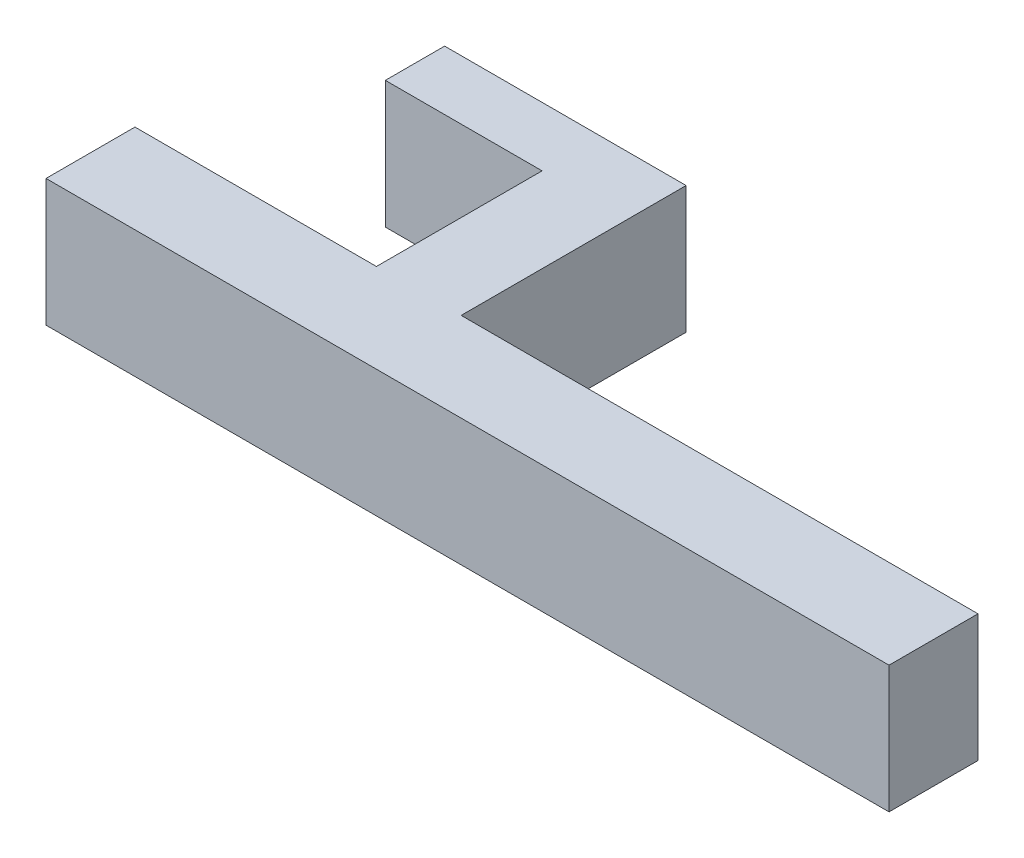
ISO-10303-21;
HEADER;
FILE_DESCRIPTION(('STEP AP214'),'2;1');
FILE_NAME('part.step','',(''),(''),'','','');
FILE_SCHEMA(('AUTOMOTIVE_DESIGN { 1 0 10303 214 1 1 1 1 }'));
ENDSEC;
DATA;
#1=APPLICATION_CONTEXT('core data for automotive mechanical design processes');
#2=APPLICATION_PROTOCOL_DEFINITION('international standard','automotive_design',2000,#1);
#3=PRODUCT_CONTEXT('',#1,'mechanical');
#4=PRODUCT('Part','Part','',(#3));
#5=PRODUCT_RELATED_PRODUCT_CATEGORY('part','',(#4));
#6=PRODUCT_DEFINITION_FORMATION('','',#4);
#7=PRODUCT_DEFINITION_CONTEXT('part definition',#1,'design');
#8=PRODUCT_DEFINITION('design','',#6,#7);
#9=PRODUCT_DEFINITION_SHAPE('','',#8);
#10=(LENGTH_UNIT() NAMED_UNIT(*) SI_UNIT(.MILLI.,.METRE.));
#11=(NAMED_UNIT(*) PLANE_ANGLE_UNIT() SI_UNIT($,.RADIAN.));
#12=(NAMED_UNIT(*) SI_UNIT($,.STERADIAN.) SOLID_ANGLE_UNIT());
#13=UNCERTAINTY_MEASURE_WITH_UNIT(LENGTH_MEASURE(1.E-05),#10,'distance_accuracy_value','');
#14=(GEOMETRIC_REPRESENTATION_CONTEXT(3) GLOBAL_UNCERTAINTY_ASSIGNED_CONTEXT((#13)) GLOBAL_UNIT_ASSIGNED_CONTEXT((#10,
#11,#12)) REPRESENTATION_CONTEXT('',''));
#15=CARTESIAN_POINT('',(0.,0.,0.));
#16=DIRECTION('',(0.,0.,1.));
#17=DIRECTION('',(1.,0.,0.));
#18=AXIS2_PLACEMENT_3D('',#15,#16,#17);
#19=CARTESIAN_POINT('',(0.,3.,-0.199999999999997));
#20=DIRECTION('',(0.,0.,1.));
#21=DIRECTION('',(1.,0.,0.));
#22=AXIS2_PLACEMENT_3D('',#19,#20,#21);
#23=PLANE('',#22);
#24=DIRECTION('',(-1.,0.,0.));
#25=VECTOR('',#24,1.);
#26=CARTESIAN_POINT('',(0.,0.,-0.199999999999997));
#27=LINE('',#26,#25);
#28=CARTESIAN_POINT('',(19.9,0.,-0.199999999999999));
#29=VERTEX_POINT('',#28);
#30=CARTESIAN_POINT('',(0.,0.,-0.199999999999999));
#31=VERTEX_POINT('',#30);
#32=EDGE_CURVE('E140',#29,#31,#27,.T.);
#33=ORIENTED_EDGE('',*,*,#32,.F.);
#34=DIRECTION('',(0.,-1.,0.));
#35=VECTOR('',#34,1.);
#36=CARTESIAN_POINT('',(19.9,3.,-0.199999999999999));
#37=LINE('',#36,#35);
#38=CARTESIAN_POINT('',(19.9,3.,-0.199999999999999));
#39=VERTEX_POINT('',#38);
#40=EDGE_CURVE('E11',#39,#29,#37,.T.);
#41=ORIENTED_EDGE('',*,*,#40,.F.);
#42=DIRECTION('',(-1.,0.,0.));
#43=VECTOR('',#42,1.);
#44=CARTESIAN_POINT('',(0.,3.,-0.199999999999997));
#45=LINE('',#44,#43);
#46=CARTESIAN_POINT('',(0.,3.,-0.199999999999999));
#47=VERTEX_POINT('',#46);
#48=EDGE_CURVE('E163',#39,#47,#45,.T.);
#49=ORIENTED_EDGE('',*,*,#48,.T.);
#50=DIRECTION('',(0.,-1.,0.));
#51=VECTOR('',#50,1.);
#52=CARTESIAN_POINT('',(0.,3.,-0.199999999999999));
#53=LINE('',#52,#51);
#54=EDGE_CURVE('E92',#47,#31,#53,.T.);
#55=ORIENTED_EDGE('',*,*,#54,.T.);
#56=EDGE_LOOP('',(#33,#41,#49,#55));
#57=FACE_BOUND('',#56,.T.);
#58=ADVANCED_FACE('F35',(#57),#23,.T.);
#59=CARTESIAN_POINT('',(19.9,3.,0.));
#60=DIRECTION('',(-1.,0.,0.));
#61=DIRECTION('',(0.,0.,1.));
#62=AXIS2_PLACEMENT_3D('',#59,#60,#61);
#63=PLANE('',#62);
#64=DIRECTION('',(0.,0.,-1.));
#65=VECTOR('',#64,1.);
#66=CARTESIAN_POINT('',(19.9,0.,0.));
#67=LINE('',#66,#65);
#68=CARTESIAN_POINT('',(19.9,0.,-2.3));
#69=VERTEX_POINT('',#68);
#70=EDGE_CURVE('E143',#29,#69,#67,.T.);
#71=ORIENTED_EDGE('',*,*,#70,.T.);
#72=DIRECTION('',(0.,-1.,0.));
#73=VECTOR('',#72,1.);
#74=CARTESIAN_POINT('',(19.9,3.,-2.3));
#75=LINE('',#74,#73);
#76=CARTESIAN_POINT('',(19.9,3.,-2.3));
#77=VERTEX_POINT('',#76);
#78=EDGE_CURVE('E43',#77,#69,#75,.T.);
#79=ORIENTED_EDGE('',*,*,#78,.F.);
#80=DIRECTION('',(0.,0.,-1.));
#81=VECTOR('',#80,1.);
#82=CARTESIAN_POINT('',(19.9,3.,0.));
#83=LINE('',#82,#81);
#84=EDGE_CURVE('E197',#39,#77,#83,.T.);
#85=ORIENTED_EDGE('',*,*,#84,.F.);
#86=ORIENTED_EDGE('',*,*,#40,.T.);
#87=EDGE_LOOP('',(#71,#79,#85,#86));
#88=FACE_BOUND('',#87,.T.);
#89=ADVANCED_FACE('F184',(#88),#63,.F.);
#90=CARTESIAN_POINT('',(0.,3.,-2.3));
#91=DIRECTION('',(0.,0.,-1.));
#92=DIRECTION('',(-1.,0.,0.));
#93=AXIS2_PLACEMENT_3D('',#90,#91,#92);
#94=PLANE('',#93);
#95=DIRECTION('',(1.,0.,0.));
#96=VECTOR('',#95,1.);
#97=CARTESIAN_POINT('',(0.,0.,-2.3));
#98=LINE('',#97,#96);
#99=CARTESIAN_POINT('',(7.7,0.,-2.3));
#100=VERTEX_POINT('',#99);
#101=EDGE_CURVE('E146',#100,#69,#98,.T.);
#102=ORIENTED_EDGE('',*,*,#101,.F.);
#103=DIRECTION('',(0.,-1.,0.));
#104=VECTOR('',#103,1.);
#105=CARTESIAN_POINT('',(7.7,3.,-2.3));
#106=LINE('',#105,#104);
#107=CARTESIAN_POINT('',(7.7,3.,-2.3));
#108=VERTEX_POINT('',#107);
#109=EDGE_CURVE('E174',#108,#100,#106,.T.);
#110=ORIENTED_EDGE('',*,*,#109,.F.);
#111=DIRECTION('',(1.,0.,0.));
#112=VECTOR('',#111,1.);
#113=CARTESIAN_POINT('',(0.,3.,-2.3));
#114=LINE('',#113,#112);
#115=EDGE_CURVE('E181',#108,#77,#114,.T.);
#116=ORIENTED_EDGE('',*,*,#115,.T.);
#117=ORIENTED_EDGE('',*,*,#78,.T.);
#118=EDGE_LOOP('',(#102,#110,#116,#117));
#119=FACE_BOUND('',#118,.T.);
#120=ADVANCED_FACE('F179',(#119),#94,.T.);
#121=CARTESIAN_POINT('',(7.70000000000001,3.,0.));
#122=DIRECTION('',(1.,0.,0.));
#123=DIRECTION('',(0.,0.,-1.));
#124=AXIS2_PLACEMENT_3D('',#121,#122,#123);
#125=PLANE('',#124);
#126=DIRECTION('',(0.,0.,1.));
#127=VECTOR('',#126,1.);
#128=CARTESIAN_POINT('',(7.70000000000001,0.,0.));
#129=LINE('',#128,#127);
#130=CARTESIAN_POINT('',(7.7,0.,-7.61));
#131=VERTEX_POINT('',#130);
#132=EDGE_CURVE('E149',#131,#100,#129,.T.);
#133=ORIENTED_EDGE('',*,*,#132,.F.);
#134=DIRECTION('',(0.,-1.,0.));
#135=VECTOR('',#134,1.);
#136=CARTESIAN_POINT('',(7.7,3.,-7.61));
#137=LINE('',#136,#135);
#138=CARTESIAN_POINT('',(7.7,3.,-7.61));
#139=VERTEX_POINT('',#138);
#140=EDGE_CURVE('E172',#139,#131,#137,.T.);
#141=ORIENTED_EDGE('',*,*,#140,.F.);
#142=DIRECTION('',(0.,0.,1.));
#143=VECTOR('',#142,1.);
#144=CARTESIAN_POINT('',(7.70000000000001,3.,0.));
#145=LINE('',#144,#143);
#146=EDGE_CURVE('E194',#139,#108,#145,.T.);
#147=ORIENTED_EDGE('',*,*,#146,.T.);
#148=ORIENTED_EDGE('',*,*,#109,.T.);
#149=EDGE_LOOP('',(#133,#141,#147,#148));
#150=FACE_BOUND('',#149,.T.);
#151=ADVANCED_FACE('F191',(#150),#125,.T.);
#152=CARTESIAN_POINT('',(0.,3.,-7.61));
#153=DIRECTION('',(0.,0.,-1.));
#154=DIRECTION('',(-1.,0.,0.));
#155=AXIS2_PLACEMENT_3D('',#152,#153,#154);
#156=PLANE('',#155);
#157=DIRECTION('',(1.,0.,0.));
#158=VECTOR('',#157,1.);
#159=CARTESIAN_POINT('',(0.,0.,-7.61));
#160=LINE('',#159,#158);
#161=CARTESIAN_POINT('',(2.,0.,-7.61));
#162=VERTEX_POINT('',#161);
#163=EDGE_CURVE('E152',#162,#131,#160,.T.);
#164=ORIENTED_EDGE('',*,*,#163,.F.);
#165=DIRECTION('',(0.,-1.,0.));
#166=VECTOR('',#165,1.);
#167=CARTESIAN_POINT('',(2.,3.,-7.61));
#168=LINE('',#167,#166);
#169=CARTESIAN_POINT('',(2.,3.,-7.61));
#170=VERTEX_POINT('',#169);
#171=EDGE_CURVE('E170',#170,#162,#168,.T.);
#172=ORIENTED_EDGE('',*,*,#171,.F.);
#173=DIRECTION('',(1.,0.,0.));
#174=VECTOR('',#173,1.);
#175=CARTESIAN_POINT('',(0.,3.,-7.61));
#176=LINE('',#175,#174);
#177=EDGE_CURVE('E199',#170,#139,#176,.T.);
#178=ORIENTED_EDGE('',*,*,#177,.T.);
#179=ORIENTED_EDGE('',*,*,#140,.T.);
#180=EDGE_LOOP('',(#164,#172,#178,#179));
#181=FACE_BOUND('',#180,.T.);
#182=ADVANCED_FACE('F227',(#181),#156,.T.);
#183=CARTESIAN_POINT('',(2.,3.,0.));
#184=DIRECTION('',(1.,0.,0.));
#185=DIRECTION('',(0.,0.,-1.));
#186=AXIS2_PLACEMENT_3D('',#183,#184,#185);
#187=PLANE('',#186);
#188=DIRECTION('',(0.,0.,1.));
#189=VECTOR('',#188,1.);
#190=CARTESIAN_POINT('',(2.,0.,0.));
#191=LINE('',#190,#189);
#192=CARTESIAN_POINT('',(2.,0.,-6.21));
#193=VERTEX_POINT('',#192);
#194=EDGE_CURVE('E155',#162,#193,#191,.T.);
#195=ORIENTED_EDGE('',*,*,#194,.T.);
#196=DIRECTION('',(0.,-1.,0.));
#197=VECTOR('',#196,1.);
#198=CARTESIAN_POINT('',(2.,3.,-6.21));
#199=LINE('',#198,#197);
#200=CARTESIAN_POINT('',(2.,3.,-6.21));
#201=VERTEX_POINT('',#200);
#202=EDGE_CURVE('E167',#201,#193,#199,.T.);
#203=ORIENTED_EDGE('',*,*,#202,.F.);
#204=DIRECTION('',(0.,0.,1.));
#205=VECTOR('',#204,1.);
#206=CARTESIAN_POINT('',(2.,3.,0.));
#207=LINE('',#206,#205);
#208=EDGE_CURVE('E205',#170,#201,#207,.T.);
#209=ORIENTED_EDGE('',*,*,#208,.F.);
#210=ORIENTED_EDGE('',*,*,#171,.T.);
#211=EDGE_LOOP('',(#195,#203,#209,#210));
#212=FACE_BOUND('',#211,.T.);
#213=ADVANCED_FACE('F209',(#212),#187,.F.);
#214=CARTESIAN_POINT('',(0.,3.,-6.21));
#215=DIRECTION('',(0.,0.,-1.));
#216=DIRECTION('',(-1.,0.,0.));
#217=AXIS2_PLACEMENT_3D('',#214,#215,#216);
#218=PLANE('',#217);
#219=DIRECTION('',(1.,0.,0.));
#220=VECTOR('',#219,1.);
#221=CARTESIAN_POINT('',(0.,0.,-6.21));
#222=LINE('',#221,#220);
#223=CARTESIAN_POINT('',(5.7,0.,-6.21));
#224=VERTEX_POINT('',#223);
#225=EDGE_CURVE('E157',#193,#224,#222,.T.);
#226=ORIENTED_EDGE('',*,*,#225,.T.);
#227=DIRECTION('',(0.,-1.,0.));
#228=VECTOR('',#227,1.);
#229=CARTESIAN_POINT('',(5.7,3.,-6.21));
#230=LINE('',#229,#228);
#231=CARTESIAN_POINT('',(5.7,3.,-6.21));
#232=VERTEX_POINT('',#231);
#233=EDGE_CURVE('E132',#232,#224,#230,.T.);
#234=ORIENTED_EDGE('',*,*,#233,.F.);
#235=DIRECTION('',(1.,0.,0.));
#236=VECTOR('',#235,1.);
#237=CARTESIAN_POINT('',(0.,3.,-6.21));
#238=LINE('',#237,#236);
#239=EDGE_CURVE('E123',#201,#232,#238,.T.);
#240=ORIENTED_EDGE('',*,*,#239,.F.);
#241=ORIENTED_EDGE('',*,*,#202,.T.);
#242=EDGE_LOOP('',(#226,#234,#240,#241));
#243=FACE_BOUND('',#242,.T.);
#244=ADVANCED_FACE('F212',(#243),#218,.F.);
#245=CARTESIAN_POINT('',(5.69999999999998,3.,0.));
#246=DIRECTION('',(1.,0.,0.));
#247=DIRECTION('',(0.,0.,-1.));
#248=AXIS2_PLACEMENT_3D('',#245,#246,#247);
#249=PLANE('',#248);
#250=DIRECTION('',(0.,0.,1.));
#251=VECTOR('',#250,1.);
#252=CARTESIAN_POINT('',(5.69999999999998,0.,0.));
#253=LINE('',#252,#251);
#254=CARTESIAN_POINT('',(5.7,0.,-2.3));
#255=VERTEX_POINT('',#254);
#256=EDGE_CURVE('E131',#224,#255,#253,.T.);
#257=ORIENTED_EDGE('',*,*,#256,.T.);
#258=DIRECTION('',(0.,-1.,0.));
#259=VECTOR('',#258,1.);
#260=CARTESIAN_POINT('',(5.7,3.,-2.3));
#261=LINE('',#260,#259);
#262=CARTESIAN_POINT('',(5.7,3.,-2.3));
#263=VERTEX_POINT('',#262);
#264=EDGE_CURVE('E128',#263,#255,#261,.T.);
#265=ORIENTED_EDGE('',*,*,#264,.F.);
#266=DIRECTION('',(0.,0.,1.));
#267=VECTOR('',#266,1.);
#268=CARTESIAN_POINT('',(5.69999999999998,3.,0.));
#269=LINE('',#268,#267);
#270=EDGE_CURVE('E117',#232,#263,#269,.T.);
#271=ORIENTED_EDGE('',*,*,#270,.F.);
#272=ORIENTED_EDGE('',*,*,#233,.T.);
#273=EDGE_LOOP('',(#257,#265,#271,#272));
#274=FACE_BOUND('',#273,.T.);
#275=ADVANCED_FACE('F129',(#274),#249,.F.);
#276=CARTESIAN_POINT('',(0.,3.,-2.3));
#277=DIRECTION('',(0.,0.,1.));
#278=DIRECTION('',(1.,0.,0.));
#279=AXIS2_PLACEMENT_3D('',#276,#277,#278);
#280=PLANE('',#279);
#281=DIRECTION('',(-1.,0.,0.));
#282=VECTOR('',#281,1.);
#283=CARTESIAN_POINT('',(0.,0.,-2.3));
#284=LINE('',#283,#282);
#285=CARTESIAN_POINT('',(0.,0.,-2.3));
#286=VERTEX_POINT('',#285);
#287=EDGE_CURVE('E85',#255,#286,#284,.T.);
#288=ORIENTED_EDGE('',*,*,#287,.T.);
#289=DIRECTION('',(0.,-1.,0.));
#290=VECTOR('',#289,1.);
#291=CARTESIAN_POINT('',(0.,3.,-2.3));
#292=LINE('',#291,#290);
#293=CARTESIAN_POINT('',(0.,3.,-2.3));
#294=VERTEX_POINT('',#293);
#295=EDGE_CURVE('E133',#294,#286,#292,.T.);
#296=ORIENTED_EDGE('',*,*,#295,.F.);
#297=DIRECTION('',(-1.,0.,0.));
#298=VECTOR('',#297,1.);
#299=CARTESIAN_POINT('',(0.,3.,-2.3));
#300=LINE('',#299,#298);
#301=EDGE_CURVE('E121',#263,#294,#300,.T.);
#302=ORIENTED_EDGE('',*,*,#301,.F.);
#303=ORIENTED_EDGE('',*,*,#264,.T.);
#304=EDGE_LOOP('',(#288,#296,#302,#303));
#305=FACE_BOUND('',#304,.T.);
#306=ADVANCED_FACE('F135',(#305),#280,.F.);
#307=CARTESIAN_POINT('',(0.,3.,0.));
#308=DIRECTION('',(1.,0.,0.));
#309=DIRECTION('',(0.,0.,-1.));
#310=AXIS2_PLACEMENT_3D('',#307,#308,#309);
#311=PLANE('',#310);
#312=DIRECTION('',(0.,0.,1.));
#313=VECTOR('',#312,1.);
#314=CARTESIAN_POINT('',(0.,0.,0.));
#315=LINE('',#314,#313);
#316=EDGE_CURVE('E161',#286,#31,#315,.T.);
#317=ORIENTED_EDGE('',*,*,#316,.T.);
#318=ORIENTED_EDGE('',*,*,#54,.F.);
#319=DIRECTION('',(0.,0.,1.));
#320=VECTOR('',#319,1.);
#321=CARTESIAN_POINT('',(0.,3.,0.));
#322=LINE('',#321,#320);
#323=EDGE_CURVE('E51',#294,#47,#322,.T.);
#324=ORIENTED_EDGE('',*,*,#323,.F.);
#325=ORIENTED_EDGE('',*,*,#295,.T.);
#326=EDGE_LOOP('',(#317,#318,#324,#325));
#327=FACE_BOUND('',#326,.T.);
#328=ADVANCED_FACE('F215',(#327),#311,.F.);
#329=CARTESIAN_POINT('',(0.,3.,0.));
#330=DIRECTION('',(0.,1.,0.));
#331=DIRECTION('',(0.,0.,1.));
#332=AXIS2_PLACEMENT_3D('',#329,#330,#331);
#333=PLANE('',#332);
#334=ORIENTED_EDGE('',*,*,#48,.F.);
#335=ORIENTED_EDGE('',*,*,#84,.T.);
#336=ORIENTED_EDGE('',*,*,#115,.F.);
#337=ORIENTED_EDGE('',*,*,#146,.F.);
#338=ORIENTED_EDGE('',*,*,#177,.F.);
#339=ORIENTED_EDGE('',*,*,#208,.T.);
#340=ORIENTED_EDGE('',*,*,#239,.T.);
#341=ORIENTED_EDGE('',*,*,#270,.T.);
#342=ORIENTED_EDGE('',*,*,#301,.T.);
#343=ORIENTED_EDGE('',*,*,#323,.T.);
#344=EDGE_LOOP('',(#334,#335,#336,#337,#338,#339,#340,#341,#342,#343));
#345=FACE_BOUND('',#344,.T.);
#346=ADVANCED_FACE('F119',(#345),#333,.T.);
#347=CARTESIAN_POINT('',(0.,0.,0.));
#348=DIRECTION('',(0.,1.,0.));
#349=DIRECTION('',(0.,0.,1.));
#350=AXIS2_PLACEMENT_3D('',#347,#348,#349);
#351=PLANE('',#350);
#352=ORIENTED_EDGE('',*,*,#32,.T.);
#353=ORIENTED_EDGE('',*,*,#316,.F.);
#354=ORIENTED_EDGE('',*,*,#287,.F.);
#355=ORIENTED_EDGE('',*,*,#256,.F.);
#356=ORIENTED_EDGE('',*,*,#225,.F.);
#357=ORIENTED_EDGE('',*,*,#194,.F.);
#358=ORIENTED_EDGE('',*,*,#163,.T.);
#359=ORIENTED_EDGE('',*,*,#132,.T.);
#360=ORIENTED_EDGE('',*,*,#101,.T.);
#361=ORIENTED_EDGE('',*,*,#70,.F.);
#362=EDGE_LOOP('',(#352,#353,#354,#355,#356,#357,#358,#359,#360,#361));
#363=FACE_BOUND('',#362,.T.);
#364=ADVANCED_FACE('F186',(#363),#351,.F.);
#365=CLOSED_SHELL('',(#58,#89,#120,#151,#182,#213,#244,#275,#306,#328,#346,#364));
#366=MANIFOLD_SOLID_BREP('B2',#365);
#367=ADVANCED_BREP_SHAPE_REPRESENTATION('',(#18,#366),#14);
#368=SHAPE_DEFINITION_REPRESENTATION(#9,#367);
ENDSEC;
END-ISO-10303-21;
